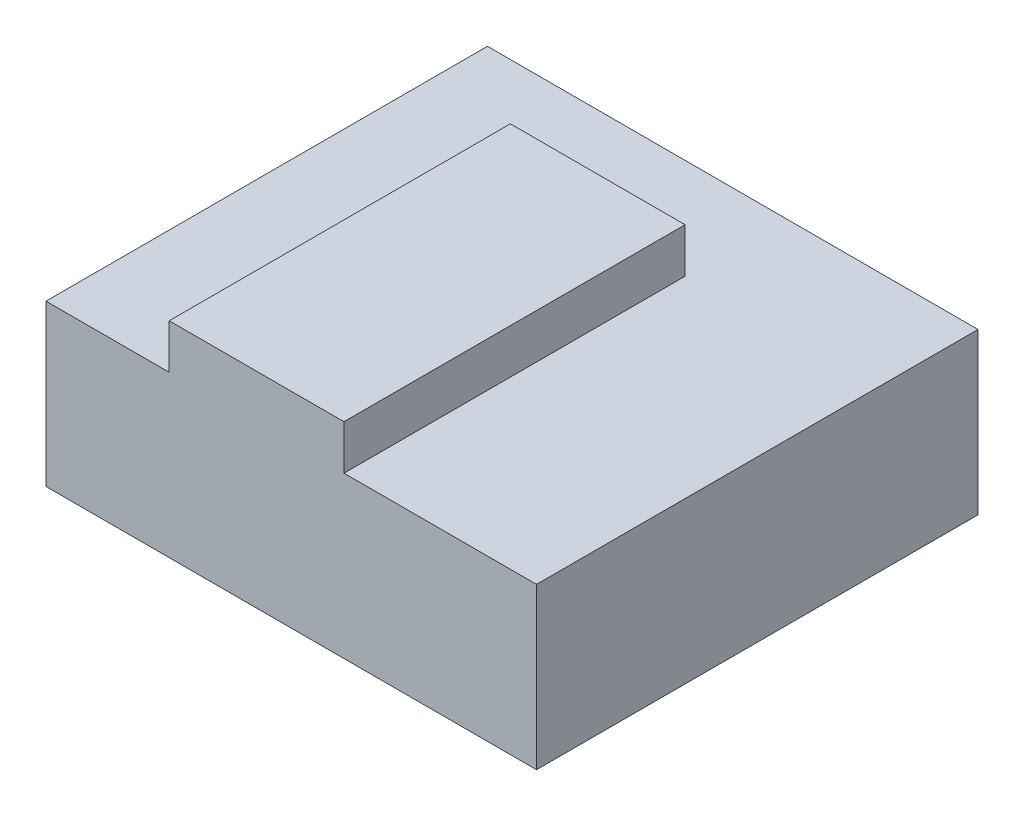
ISO-10303-21;
HEADER;
FILE_DESCRIPTION(('STEP AP214'),'2;1');
FILE_NAME('part.step','',(''),(''),'','','');
FILE_SCHEMA(('AUTOMOTIVE_DESIGN { 1 0 10303 214 1 1 1 1 }'));
ENDSEC;
DATA;
#1=APPLICATION_CONTEXT('core data for automotive mechanical design processes');
#2=APPLICATION_PROTOCOL_DEFINITION('international standard','automotive_design',2000,#1);
#3=PRODUCT_CONTEXT('',#1,'mechanical');
#4=PRODUCT('Part','Part','',(#3));
#5=PRODUCT_RELATED_PRODUCT_CATEGORY('part','',(#4));
#6=PRODUCT_DEFINITION_FORMATION('','',#4);
#7=PRODUCT_DEFINITION_CONTEXT('part definition',#1,'design');
#8=PRODUCT_DEFINITION('design','',#6,#7);
#9=PRODUCT_DEFINITION_SHAPE('','',#8);
#10=(LENGTH_UNIT() NAMED_UNIT(*) SI_UNIT(.MILLI.,.METRE.));
#11=(NAMED_UNIT(*) PLANE_ANGLE_UNIT() SI_UNIT($,.RADIAN.));
#12=(NAMED_UNIT(*) SI_UNIT($,.STERADIAN.) SOLID_ANGLE_UNIT());
#13=UNCERTAINTY_MEASURE_WITH_UNIT(LENGTH_MEASURE(1.E-05),#10,'distance_accuracy_value','');
#14=(GEOMETRIC_REPRESENTATION_CONTEXT(3) GLOBAL_UNCERTAINTY_ASSIGNED_CONTEXT((#13)) GLOBAL_UNIT_ASSIGNED_CONTEXT((#10,
#11,#12)) REPRESENTATION_CONTEXT('',''));
#15=CARTESIAN_POINT('',(0.,0.,0.));
#16=DIRECTION('',(0.,0.,1.));
#17=DIRECTION('',(1.,0.,0.));
#18=AXIS2_PLACEMENT_3D('',#15,#16,#17);
#19=CARTESIAN_POINT('',(0.,46.,0.));
#20=DIRECTION('',(1.,0.,0.));
#21=DIRECTION('',(0.,0.,-1.));
#22=AXIS2_PLACEMENT_3D('',#19,#20,#21);
#23=PLANE('',#22);
#24=DIRECTION('',(0.,0.,1.));
#25=VECTOR('',#24,1.);
#26=CARTESIAN_POINT('',(0.,36.,0.));
#27=LINE('',#26,#25);
#28=CARTESIAN_POINT('',(0.,36.,-99.));
#29=VERTEX_POINT('',#28);
#30=CARTESIAN_POINT('',(0.,36.,0.));
#31=VERTEX_POINT('',#30);
#32=EDGE_CURVE('E109',#29,#31,#27,.T.);
#33=ORIENTED_EDGE('',*,*,#32,.F.);
#34=DIRECTION('',(0.,-1.,0.));
#35=VECTOR('',#34,1.);
#36=CARTESIAN_POINT('',(0.,46.,-99.));
#37=LINE('',#36,#35);
#38=CARTESIAN_POINT('',(0.,0.,-99.));
#39=VERTEX_POINT('',#38);
#40=EDGE_CURVE('E55',#29,#39,#37,.T.);
#41=ORIENTED_EDGE('',*,*,#40,.T.);
#42=DIRECTION('',(0.,0.,1.));
#43=VECTOR('',#42,1.);
#44=CARTESIAN_POINT('',(0.,0.,0.));
#45=LINE('',#44,#43);
#46=CARTESIAN_POINT('',(0.,0.,0.));
#47=VERTEX_POINT('',#46);
#48=EDGE_CURVE('E129',#39,#47,#45,.T.);
#49=ORIENTED_EDGE('',*,*,#48,.T.);
#50=DIRECTION('',(0.,-1.,0.));
#51=VECTOR('',#50,1.);
#52=CARTESIAN_POINT('',(0.,46.,0.));
#53=LINE('',#52,#51);
#54=EDGE_CURVE('E11',#31,#47,#53,.T.);
#55=ORIENTED_EDGE('',*,*,#54,.F.);
#56=EDGE_LOOP('',(#33,#41,#49,#55));
#57=FACE_BOUND('',#56,.T.);
#58=ADVANCED_FACE('F33',(#57),#23,.F.);
#59=CARTESIAN_POINT('',(0.,46.,0.));
#60=DIRECTION('',(0.,0.,-1.));
#61=DIRECTION('',(-1.,0.,0.));
#62=AXIS2_PLACEMENT_3D('',#59,#60,#61);
#63=PLANE('',#62);
#64=DIRECTION('',(1.,0.,0.));
#65=VECTOR('',#64,1.);
#66=CARTESIAN_POINT('',(0.,46.,0.));
#67=LINE('',#66,#65);
#68=CARTESIAN_POINT('',(27.6267054069308,46.,0.));
#69=VERTEX_POINT('',#68);
#70=CARTESIAN_POINT('',(66.8189641760364,46.,0.));
#71=VERTEX_POINT('',#70);
#72=EDGE_CURVE('E119',#69,#71,#67,.T.);
#73=ORIENTED_EDGE('',*,*,#72,.F.);
#74=DIRECTION('',(0.,1.,0.));
#75=VECTOR('',#74,1.);
#76=CARTESIAN_POINT('',(27.6267054069308,36.,0.));
#77=LINE('',#76,#75);
#78=CARTESIAN_POINT('',(27.6267054069308,36.,0.));
#79=VERTEX_POINT('',#78);
#80=EDGE_CURVE('E47',#79,#69,#77,.T.);
#81=ORIENTED_EDGE('',*,*,#80,.F.);
#82=DIRECTION('',(1.,0.,0.));
#83=VECTOR('',#82,1.);
#84=CARTESIAN_POINT('',(0.,36.,0.));
#85=LINE('',#84,#83);
#86=EDGE_CURVE('E105',#31,#79,#85,.T.);
#87=ORIENTED_EDGE('',*,*,#86,.F.);
#88=ORIENTED_EDGE('',*,*,#54,.T.);
#89=DIRECTION('',(1.,0.,0.));
#90=VECTOR('',#89,1.);
#91=CARTESIAN_POINT('',(0.,0.,0.));
#92=LINE('',#91,#90);
#93=CARTESIAN_POINT('',(110.,0.,0.));
#94=VERTEX_POINT('',#93);
#95=EDGE_CURVE('E131',#47,#94,#92,.T.);
#96=ORIENTED_EDGE('',*,*,#95,.T.);
#97=DIRECTION('',(0.,-1.,0.));
#98=VECTOR('',#97,1.);
#99=CARTESIAN_POINT('',(110.,46.,0.));
#100=LINE('',#99,#98);
#101=CARTESIAN_POINT('',(110.,36.,0.));
#102=VERTEX_POINT('',#101);
#103=EDGE_CURVE('E40',#102,#94,#100,.T.);
#104=ORIENTED_EDGE('',*,*,#103,.F.);
#105=CARTESIAN_POINT('',(66.8189641760364,36.,0.));
#106=VERTEX_POINT('',#105);
#107=EDGE_CURVE('E114',#106,#102,#85,.T.);
#108=ORIENTED_EDGE('',*,*,#107,.F.);
#109=DIRECTION('',(0.,1.,0.));
#110=VECTOR('',#109,1.);
#111=CARTESIAN_POINT('',(66.8189641760364,36.,0.));
#112=LINE('',#111,#110);
#113=EDGE_CURVE('E132',#106,#71,#112,.T.);
#114=ORIENTED_EDGE('',*,*,#113,.T.);
#115=EDGE_LOOP('',(#73,#81,#87,#88,#96,#104,#108,#114));
#116=FACE_BOUND('',#115,.T.);
#117=ADVANCED_FACE('F116',(#116),#63,.F.);
#118=CARTESIAN_POINT('',(110.,46.,0.));
#119=DIRECTION('',(-1.,0.,0.));
#120=DIRECTION('',(0.,0.,1.));
#121=AXIS2_PLACEMENT_3D('',#118,#119,#120);
#122=PLANE('',#121);
#123=DIRECTION('',(0.,0.,-1.));
#124=VECTOR('',#123,1.);
#125=CARTESIAN_POINT('',(110.,36.,0.));
#126=LINE('',#125,#124);
#127=CARTESIAN_POINT('',(110.,36.,-99.));
#128=VERTEX_POINT('',#127);
#129=EDGE_CURVE('E148',#102,#128,#126,.T.);
#130=ORIENTED_EDGE('',*,*,#129,.F.);
#131=ORIENTED_EDGE('',*,*,#103,.T.);
#132=DIRECTION('',(0.,0.,-1.));
#133=VECTOR('',#132,1.);
#134=CARTESIAN_POINT('',(110.,0.,0.));
#135=LINE('',#134,#133);
#136=CARTESIAN_POINT('',(110.,0.,-99.));
#137=VERTEX_POINT('',#136);
#138=EDGE_CURVE('E135',#94,#137,#135,.T.);
#139=ORIENTED_EDGE('',*,*,#138,.T.);
#140=DIRECTION('',(0.,-1.,0.));
#141=VECTOR('',#140,1.);
#142=CARTESIAN_POINT('',(110.,46.,-99.));
#143=LINE('',#142,#141);
#144=EDGE_CURVE('E140',#128,#137,#143,.T.);
#145=ORIENTED_EDGE('',*,*,#144,.F.);
#146=EDGE_LOOP('',(#130,#131,#139,#145));
#147=FACE_BOUND('',#146,.T.);
#148=ADVANCED_FACE('F144',(#147),#122,.F.);
#149=CARTESIAN_POINT('',(0.,46.,-99.));
#150=DIRECTION('',(0.,0.,1.));
#151=DIRECTION('',(1.,0.,0.));
#152=AXIS2_PLACEMENT_3D('',#149,#150,#151);
#153=PLANE('',#152);
#154=DIRECTION('',(-1.,0.,0.));
#155=VECTOR('',#154,1.);
#156=CARTESIAN_POINT('',(0.,36.,-99.));
#157=LINE('',#156,#155);
#158=EDGE_CURVE('E123',#128,#29,#157,.T.);
#159=ORIENTED_EDGE('',*,*,#158,.F.);
#160=ORIENTED_EDGE('',*,*,#144,.T.);
#161=DIRECTION('',(-1.,0.,0.));
#162=VECTOR('',#161,1.);
#163=CARTESIAN_POINT('',(0.,0.,-99.));
#164=LINE('',#163,#162);
#165=EDGE_CURVE('E128',#137,#39,#164,.T.);
#166=ORIENTED_EDGE('',*,*,#165,.T.);
#167=ORIENTED_EDGE('',*,*,#40,.F.);
#168=EDGE_LOOP('',(#159,#160,#166,#167));
#169=FACE_BOUND('',#168,.T.);
#170=ADVANCED_FACE('F156',(#169),#153,.F.);
#171=CARTESIAN_POINT('',(0.,46.,0.));
#172=DIRECTION('',(0.,-1.,0.));
#173=DIRECTION('',(0.,0.,-1.));
#174=AXIS2_PLACEMENT_3D('',#171,#172,#173);
#175=PLANE('',#174);
#176=DIRECTION('',(0.,0.,-1.));
#177=VECTOR('',#176,1.);
#178=CARTESIAN_POINT('',(66.8189641760364,46.,0.));
#179=LINE('',#178,#177);
#180=CARTESIAN_POINT('',(66.8189641760364,46.,-76.5034666167708));
#181=VERTEX_POINT('',#180);
#182=EDGE_CURVE('E112',#71,#181,#179,.T.);
#183=ORIENTED_EDGE('',*,*,#182,.T.);
#184=DIRECTION('',(-1.,0.,0.));
#185=VECTOR('',#184,1.);
#186=CARTESIAN_POINT('',(0.,46.,-76.5034666167708));
#187=LINE('',#186,#185);
#188=CARTESIAN_POINT('',(27.6267054069308,46.,-76.5034666167708));
#189=VERTEX_POINT('',#188);
#190=EDGE_CURVE('E163',#181,#189,#187,.T.);
#191=ORIENTED_EDGE('',*,*,#190,.T.);
#192=DIRECTION('',(0.,0.,-1.));
#193=VECTOR('',#192,1.);
#194=CARTESIAN_POINT('',(27.6267054069308,46.,0.));
#195=LINE('',#194,#193);
#196=EDGE_CURVE('E161',#69,#189,#195,.T.);
#197=ORIENTED_EDGE('',*,*,#196,.F.);
#198=ORIENTED_EDGE('',*,*,#72,.T.);
#199=EDGE_LOOP('',(#183,#191,#197,#198));
#200=FACE_BOUND('',#199,.T.);
#201=ADVANCED_FACE('F177',(#200),#175,.F.);
#202=CARTESIAN_POINT('',(0.,0.,0.));
#203=DIRECTION('',(0.,-1.,0.));
#204=DIRECTION('',(0.,0.,-1.));
#205=AXIS2_PLACEMENT_3D('',#202,#203,#204);
#206=PLANE('',#205);
#207=ORIENTED_EDGE('',*,*,#48,.F.);
#208=ORIENTED_EDGE('',*,*,#165,.F.);
#209=ORIENTED_EDGE('',*,*,#138,.F.);
#210=ORIENTED_EDGE('',*,*,#95,.F.);
#211=EDGE_LOOP('',(#207,#208,#209,#210));
#212=FACE_BOUND('',#211,.T.);
#213=ADVANCED_FACE('F153',(#212),#206,.T.);
#214=CARTESIAN_POINT('',(66.8189641760364,36.,0.));
#215=DIRECTION('',(1.,0.,0.));
#216=DIRECTION('',(0.,0.,-1.));
#217=AXIS2_PLACEMENT_3D('',#214,#215,#216);
#218=PLANE('',#217);
#219=ORIENTED_EDGE('',*,*,#182,.F.);
#220=ORIENTED_EDGE('',*,*,#113,.F.);
#221=DIRECTION('',(0.,0.,-1.));
#222=VECTOR('',#221,1.);
#223=CARTESIAN_POINT('',(66.8189641760364,36.,0.));
#224=LINE('',#223,#222);
#225=CARTESIAN_POINT('',(66.8189641760364,36.,-76.5034666167708));
#226=VERTEX_POINT('',#225);
#227=EDGE_CURVE('E173',#106,#226,#224,.T.);
#228=ORIENTED_EDGE('',*,*,#227,.T.);
#229=DIRECTION('',(0.,1.,0.));
#230=VECTOR('',#229,1.);
#231=CARTESIAN_POINT('',(66.8189641760364,36.,-76.5034666167708));
#232=LINE('',#231,#230);
#233=EDGE_CURVE('E121',#226,#181,#232,.T.);
#234=ORIENTED_EDGE('',*,*,#233,.T.);
#235=EDGE_LOOP('',(#219,#220,#228,#234));
#236=FACE_BOUND('',#235,.T.);
#237=ADVANCED_FACE('F171',(#236),#218,.T.);
#238=CARTESIAN_POINT('',(0.,36.,-76.5034666167708));
#239=DIRECTION('',(0.,0.,-1.));
#240=DIRECTION('',(-1.,0.,0.));
#241=AXIS2_PLACEMENT_3D('',#238,#239,#240);
#242=PLANE('',#241);
#243=ORIENTED_EDGE('',*,*,#190,.F.);
#244=ORIENTED_EDGE('',*,*,#233,.F.);
#245=DIRECTION('',(-1.,0.,0.));
#246=VECTOR('',#245,1.);
#247=CARTESIAN_POINT('',(0.,36.,-76.5034666167708));
#248=LINE('',#247,#246);
#249=CARTESIAN_POINT('',(27.6267054069308,36.,-76.5034666167708));
#250=VERTEX_POINT('',#249);
#251=EDGE_CURVE('E104',#226,#250,#248,.T.);
#252=ORIENTED_EDGE('',*,*,#251,.T.);
#253=DIRECTION('',(0.,1.,0.));
#254=VECTOR('',#253,1.);
#255=CARTESIAN_POINT('',(27.6267054069308,36.,-76.5034666167708));
#256=LINE('',#255,#254);
#257=EDGE_CURVE('E101',#250,#189,#256,.T.);
#258=ORIENTED_EDGE('',*,*,#257,.T.);
#259=EDGE_LOOP('',(#243,#244,#252,#258));
#260=FACE_BOUND('',#259,.T.);
#261=ADVANCED_FACE('F175',(#260),#242,.T.);
#262=CARTESIAN_POINT('',(27.6267054069308,36.,0.));
#263=DIRECTION('',(1.,0.,0.));
#264=DIRECTION('',(0.,0.,-1.));
#265=AXIS2_PLACEMENT_3D('',#262,#263,#264);
#266=PLANE('',#265);
#267=ORIENTED_EDGE('',*,*,#196,.T.);
#268=ORIENTED_EDGE('',*,*,#257,.F.);
#269=DIRECTION('',(0.,0.,-1.));
#270=VECTOR('',#269,1.);
#271=CARTESIAN_POINT('',(27.6267054069308,36.,0.));
#272=LINE('',#271,#270);
#273=EDGE_CURVE('E98',#79,#250,#272,.T.);
#274=ORIENTED_EDGE('',*,*,#273,.F.);
#275=ORIENTED_EDGE('',*,*,#80,.T.);
#276=EDGE_LOOP('',(#267,#268,#274,#275));
#277=FACE_BOUND('',#276,.T.);
#278=ADVANCED_FACE('F100',(#277),#266,.F.);
#279=CARTESIAN_POINT('',(0.,36.,0.));
#280=DIRECTION('',(0.,1.,0.));
#281=DIRECTION('',(0.,0.,1.));
#282=AXIS2_PLACEMENT_3D('',#279,#280,#281);
#283=PLANE('',#282);
#284=ORIENTED_EDGE('',*,*,#86,.T.);
#285=ORIENTED_EDGE('',*,*,#273,.T.);
#286=ORIENTED_EDGE('',*,*,#251,.F.);
#287=ORIENTED_EDGE('',*,*,#227,.F.);
#288=ORIENTED_EDGE('',*,*,#107,.T.);
#289=ORIENTED_EDGE('',*,*,#129,.T.);
#290=ORIENTED_EDGE('',*,*,#158,.T.);
#291=ORIENTED_EDGE('',*,*,#32,.T.);
#292=EDGE_LOOP('',(#284,#285,#286,#287,#288,#289,#290,#291));
#293=FACE_BOUND('',#292,.T.);
#294=ADVANCED_FACE('F108',(#293),#283,.T.);
#295=CLOSED_SHELL('',(#58,#117,#148,#170,#201,#213,#237,#261,#278,#294));
#296=MANIFOLD_SOLID_BREP('B2',#295);
#297=ADVANCED_BREP_SHAPE_REPRESENTATION('',(#18,#296),#14);
#298=SHAPE_DEFINITION_REPRESENTATION(#9,#297);
ENDSEC;
END-ISO-10303-21;
